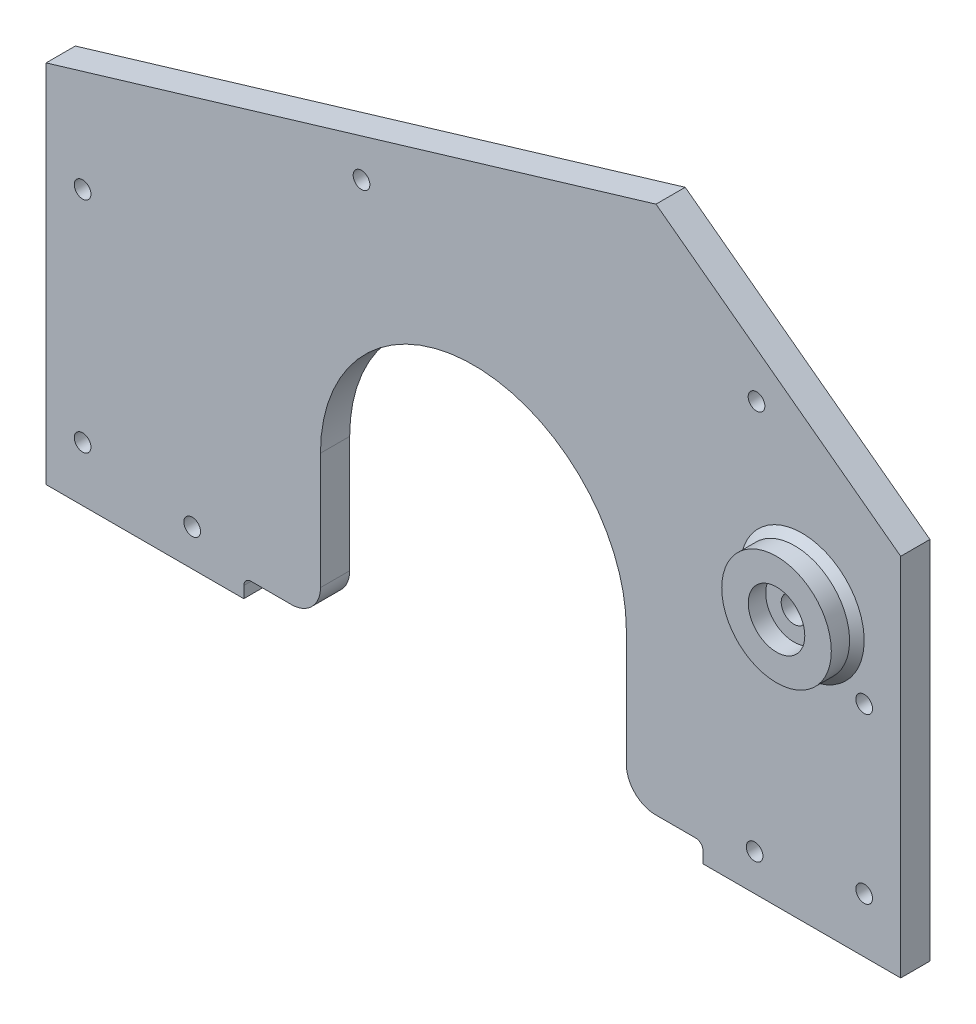
ISO-10303-21;
HEADER;
FILE_DESCRIPTION(('STEP AP214'),'2;1');
FILE_NAME('part.step','',(''),(''),'','','');
FILE_SCHEMA(('AUTOMOTIVE_DESIGN { 1 0 10303 214 1 1 1 1 }'));
ENDSEC;
DATA;
#1=APPLICATION_CONTEXT('core data for automotive mechanical design processes');
#2=APPLICATION_PROTOCOL_DEFINITION('international standard','automotive_design',2000,#1);
#3=PRODUCT_CONTEXT('',#1,'mechanical');
#4=PRODUCT('Part','Part','',(#3));
#5=PRODUCT_RELATED_PRODUCT_CATEGORY('part','',(#4));
#6=PRODUCT_DEFINITION_FORMATION('','',#4);
#7=PRODUCT_DEFINITION_CONTEXT('part definition',#1,'design');
#8=PRODUCT_DEFINITION('design','',#6,#7);
#9=PRODUCT_DEFINITION_SHAPE('','',#8);
#10=(LENGTH_UNIT() NAMED_UNIT(*) SI_UNIT(.MILLI.,.METRE.));
#11=(NAMED_UNIT(*) PLANE_ANGLE_UNIT() SI_UNIT($,.RADIAN.));
#12=(NAMED_UNIT(*) SI_UNIT($,.STERADIAN.) SOLID_ANGLE_UNIT());
#13=UNCERTAINTY_MEASURE_WITH_UNIT(LENGTH_MEASURE(1.E-05),#10,'distance_accuracy_value','');
#14=(GEOMETRIC_REPRESENTATION_CONTEXT(3) GLOBAL_UNCERTAINTY_ASSIGNED_CONTEXT((#13)) GLOBAL_UNIT_ASSIGNED_CONTEXT((#10,
#11,#12)) REPRESENTATION_CONTEXT('',''));
#15=CARTESIAN_POINT('',(0.,0.,0.));
#16=DIRECTION('',(0.,0.,1.));
#17=DIRECTION('',(1.,0.,0.));
#18=AXIS2_PLACEMENT_3D('',#15,#16,#17);
#19=CARTESIAN_POINT('',(71.7933930921227,5.32652504062577,-2.));
#20=DIRECTION('',(0.,0.,1.));
#21=DIRECTION('',(1.,0.,0.));
#22=AXIS2_PLACEMENT_3D('',#19,#20,#21);
#23=CYLINDRICAL_SURFACE('',#22,3.50000000000001);
#24=CARTESIAN_POINT('',(71.7933930921227,5.32652504062577,0.));
#25=DIRECTION('',(0.,0.,-1.));
#26=DIRECTION('',(-1.,0.,0.));
#27=AXIS2_PLACEMENT_3D('',#24,#25,#26);
#28=CIRCLE('',#27,3.50000000000001);
#29=CARTESIAN_POINT('',(68.2933930921227,5.32652504062577,0.));
#30=VERTEX_POINT('',#29);
#31=EDGE_CURVE('E186',#30,#30,#28,.T.);
#32=ORIENTED_EDGE('',*,*,#31,.T.);
#33=EDGE_LOOP('',(#32));
#34=FACE_BOUND('',#33,.T.);
#35=CARTESIAN_POINT('',(71.7933930921227,5.32652504062577,10.222));
#36=DIRECTION('',(0.,0.,1.));
#37=DIRECTION('',(1.,0.,0.));
#38=AXIS2_PLACEMENT_3D('',#35,#36,#37);
#39=CIRCLE('',#38,3.50000000000001);
#40=CARTESIAN_POINT('',(75.2933930921227,5.32652504062577,10.222));
#41=VERTEX_POINT('',#40);
#42=EDGE_CURVE('E235',#41,#41,#39,.F.);
#43=ORIENTED_EDGE('',*,*,#42,.F.);
#44=EDGE_LOOP('',(#43));
#45=FACE_BOUND('',#44,.T.);
#46=ADVANCED_FACE('F41',(#34,#45),#23,.F.);
#47=CARTESIAN_POINT('',(98.7933930921227,-69.6734749593742,8.));
#48=DIRECTION('',(0.,1.,0.));
#49=DIRECTION('',(-1.,0.,0.));
#50=AXIS2_PLACEMENT_3D('',#47,#48,#49);
#51=PLANE('',#50);
#52=DIRECTION('',(1.,0.,0.));
#53=VECTOR('',#52,1.);
#54=CARTESIAN_POINT('',(98.7933930921227,-69.6734749593742,8.));
#55=LINE('',#54,#53);
#56=CARTESIAN_POINT('',(44.6683930921227,-69.6734749593742,8.));
#57=VERTEX_POINT('',#56);
#58=CARTESIAN_POINT('',(98.7933930921227,-69.6734749593742,8.));
#59=VERTEX_POINT('',#58);
#60=EDGE_CURVE('E207',#57,#59,#55,.T.);
#61=ORIENTED_EDGE('',*,*,#60,.F.);
#62=DIRECTION('',(0.,0.,-1.));
#63=VECTOR('',#62,1.);
#64=CARTESIAN_POINT('',(44.6683930921227,-69.6734749593742,8.));
#65=LINE('',#64,#63);
#66=CARTESIAN_POINT('',(44.6683930921227,-69.6734749593742,0.));
#67=VERTEX_POINT('',#66);
#68=EDGE_CURVE('E173',#57,#67,#65,.T.);
#69=ORIENTED_EDGE('',*,*,#68,.T.);
#70=DIRECTION('',(1.,0.,0.));
#71=VECTOR('',#70,1.);
#72=CARTESIAN_POINT('',(98.7933930921227,-69.6734749593742,0.));
#73=LINE('',#72,#71);
#74=CARTESIAN_POINT('',(98.7933930921227,-69.6734749593742,0.));
#75=VERTEX_POINT('',#74);
#76=EDGE_CURVE('E193',#67,#75,#73,.T.);
#77=ORIENTED_EDGE('',*,*,#76,.T.);
#78=DIRECTION('',(0.,0.,-1.));
#79=VECTOR('',#78,1.);
#80=CARTESIAN_POINT('',(98.7933930921227,-69.6734749593742,8.));
#81=LINE('',#80,#79);
#82=EDGE_CURVE('E174',#59,#75,#81,.T.);
#83=ORIENTED_EDGE('',*,*,#82,.F.);
#84=EDGE_LOOP('',(#61,#69,#77,#83));
#85=FACE_BOUND('',#84,.T.);
#86=ADVANCED_FACE('F291',(#85),#51,.F.);
#87=CARTESIAN_POINT('',(0.,0.,8.));
#88=DIRECTION('',(0.,0.,-1.));
#89=DIRECTION('',(-1.,0.,0.));
#90=AXIS2_PLACEMENT_3D('',#87,#88,#89);
#91=PLANE('',#90);
#92=CARTESIAN_POINT('',(71.7933930921227,5.32652504062577,8.));
#93=DIRECTION('',(0.,0.,-1.));
#94=DIRECTION('',(-1.,0.,0.));
#95=AXIS2_PLACEMENT_3D('',#92,#93,#94);
#96=CIRCLE('',#95,17.);
#97=CARTESIAN_POINT('',(54.7933930921227,5.32652504062577,8.));
#98=VERTEX_POINT('',#97);
#99=EDGE_CURVE('E11',#98,#98,#96,.T.);
#100=ORIENTED_EDGE('',*,*,#99,.T.);
#101=EDGE_LOOP('',(#100));
#102=FACE_BOUND('',#101,.T.);
#103=DIRECTION('',(0.,1.,0.));
#104=VECTOR('',#103,1.);
#105=CARTESIAN_POINT('',(-81.0816069078773,0.,8.));
#106=LINE('',#105,#104);
#107=CARTESIAN_POINT('',(-81.0816069078773,-69.6734749593742,8.));
#108=VERTEX_POINT('',#107);
#109=CARTESIAN_POINT('',(-81.0816069078773,-66.5434749593742,8.));
#110=VERTEX_POINT('',#109);
#111=EDGE_CURVE('E168',#108,#110,#106,.T.);
#112=ORIENTED_EDGE('',*,*,#111,.T.);
#113=CARTESIAN_POINT('',(-79.0816069078773,-66.5434749593742,8.));
#114=DIRECTION('',(0.,0.,-1.));
#115=DIRECTION('',(-1.,0.,0.));
#116=AXIS2_PLACEMENT_3D('',#113,#114,#115);
#117=CIRCLE('',#116,2.);
#118=CARTESIAN_POINT('',(-79.0816069078773,-64.5434749593742,8.));
#119=VERTEX_POINT('',#118);
#120=EDGE_CURVE('E269',#110,#119,#117,.T.);
#121=ORIENTED_EDGE('',*,*,#120,.T.);
#122=DIRECTION('',(1.,0.,0.));
#123=VECTOR('',#122,1.);
#124=CARTESIAN_POINT('',(0.,-64.5434749593742,8.));
#125=LINE('',#124,#123);
#126=CARTESIAN_POINT('',(-68.0816069078773,-64.5434749593742,8.));
#127=VERTEX_POINT('',#126);
#128=EDGE_CURVE('E393',#119,#127,#125,.T.);
#129=ORIENTED_EDGE('',*,*,#128,.T.);
#130=CARTESIAN_POINT('',(-68.0816069078773,-56.5434749593742,8.));
#131=DIRECTION('',(0.,0.,-1.));
#132=DIRECTION('',(-1.,0.,0.));
#133=AXIS2_PLACEMENT_3D('',#130,#131,#132);
#134=CIRCLE('',#133,8.);
#135=CARTESIAN_POINT('',(-60.0816069078773,-56.5434749593742,8.));
#136=VERTEX_POINT('',#135);
#137=EDGE_CURVE('E247',#127,#136,#134,.F.);
#138=ORIENTED_EDGE('',*,*,#137,.T.);
#139=DIRECTION('',(0.,1.,0.));
#140=VECTOR('',#139,1.);
#141=CARTESIAN_POINT('',(-60.0816069078773,0.,8.));
#142=LINE('',#141,#140);
#143=CARTESIAN_POINT('',(-60.0816069078773,-24.6734749593742,8.));
#144=VERTEX_POINT('',#143);
#145=EDGE_CURVE('E391',#136,#144,#142,.T.);
#146=ORIENTED_EDGE('',*,*,#145,.T.);
#147=CARTESIAN_POINT('',(-18.2066069078773,-24.6734749593742,8.));
#148=DIRECTION('',(0.,0.,-1.));
#149=DIRECTION('',(-1.,0.,0.));
#150=AXIS2_PLACEMENT_3D('',#147,#148,#149);
#151=CIRCLE('',#150,41.875);
#152=CARTESIAN_POINT('',(23.6683930921227,-24.6734749593742,8.));
#153=VERTEX_POINT('',#152);
#154=EDGE_CURVE('E400',#144,#153,#151,.T.);
#155=ORIENTED_EDGE('',*,*,#154,.T.);
#156=DIRECTION('',(0.,-1.,0.));
#157=VECTOR('',#156,1.);
#158=CARTESIAN_POINT('',(23.6683930921227,0.,8.));
#159=LINE('',#158,#157);
#160=CARTESIAN_POINT('',(23.6683930921227,-56.5434749593742,8.));
#161=VERTEX_POINT('',#160);
#162=EDGE_CURVE('E397',#153,#161,#159,.T.);
#163=ORIENTED_EDGE('',*,*,#162,.T.);
#164=CARTESIAN_POINT('',(31.6683930921227,-56.5434749593742,8.));
#165=DIRECTION('',(0.,0.,-1.));
#166=DIRECTION('',(-1.,0.,0.));
#167=AXIS2_PLACEMENT_3D('',#164,#165,#166);
#168=CIRCLE('',#167,8.);
#169=CARTESIAN_POINT('',(31.6683930921227,-64.5434749593742,8.));
#170=VERTEX_POINT('',#169);
#171=EDGE_CURVE('E245',#161,#170,#168,.F.);
#172=ORIENTED_EDGE('',*,*,#171,.T.);
#173=DIRECTION('',(1.,0.,0.));
#174=VECTOR('',#173,1.);
#175=CARTESIAN_POINT('',(0.,-64.5434749593742,8.));
#176=LINE('',#175,#174);
#177=CARTESIAN_POINT('',(42.6683930921227,-64.5434749593742,8.));
#178=VERTEX_POINT('',#177);
#179=EDGE_CURVE('E395',#170,#178,#176,.T.);
#180=ORIENTED_EDGE('',*,*,#179,.T.);
#181=CARTESIAN_POINT('',(42.6683930921227,-66.5434749593742,8.));
#182=DIRECTION('',(0.,0.,-1.));
#183=DIRECTION('',(-1.,0.,0.));
#184=AXIS2_PLACEMENT_3D('',#181,#182,#183);
#185=CIRCLE('',#184,2.);
#186=CARTESIAN_POINT('',(44.6683930921227,-66.5434749593742,8.));
#187=VERTEX_POINT('',#186);
#188=EDGE_CURVE('E57',#178,#187,#185,.T.);
#189=ORIENTED_EDGE('',*,*,#188,.T.);
#190=DIRECTION('',(0.,-1.,0.));
#191=VECTOR('',#190,1.);
#192=CARTESIAN_POINT('',(44.6683930921227,0.,8.));
#193=LINE('',#192,#191);
#194=EDGE_CURVE('E386',#187,#57,#193,.T.);
#195=ORIENTED_EDGE('',*,*,#194,.T.);
#196=ORIENTED_EDGE('',*,*,#60,.T.);
#197=DIRECTION('',(0.,1.,0.));
#198=VECTOR('',#197,1.);
#199=CARTESIAN_POINT('',(98.7933930921227,30.3265250406258,8.));
#200=LINE('',#199,#198);
#201=CARTESIAN_POINT('',(98.7933930921227,30.3265250406258,8.));
#202=VERTEX_POINT('',#201);
#203=EDGE_CURVE('E454',#59,#202,#200,.T.);
#204=ORIENTED_EDGE('',*,*,#203,.T.);
#205=DIRECTION('',(-0.801433113275891,0.598084412892456,0.));
#206=VECTOR('',#205,1.);
#207=CARTESIAN_POINT('',(31.7933930921227,80.3265250406258,8.));
#208=LINE('',#207,#206);
#209=CARTESIAN_POINT('',(31.7933930921227,80.3265250406258,8.));
#210=VERTEX_POINT('',#209);
#211=EDGE_CURVE('E456',#202,#210,#208,.T.);
#212=ORIENTED_EDGE('',*,*,#211,.T.);
#213=DIRECTION('',(-0.957984024069043,-0.286821564092528,0.));
#214=VECTOR('',#213,1.);
#215=CARTESIAN_POINT('',(-135.206606907877,30.3265250406258,8.));
#216=LINE('',#215,#214);
#217=CARTESIAN_POINT('',(-135.206606907877,30.3265250406258,8.));
#218=VERTEX_POINT('',#217);
#219=EDGE_CURVE('E457',#210,#218,#216,.T.);
#220=ORIENTED_EDGE('',*,*,#219,.T.);
#221=DIRECTION('',(0.,-1.,0.));
#222=VECTOR('',#221,1.);
#223=CARTESIAN_POINT('',(-135.206606907877,-69.6734749593742,8.));
#224=LINE('',#223,#222);
#225=CARTESIAN_POINT('',(-135.206606907877,-69.6734749593742,8.));
#226=VERTEX_POINT('',#225);
#227=EDGE_CURVE('E199',#218,#226,#224,.T.);
#228=ORIENTED_EDGE('',*,*,#227,.T.);
#229=EDGE_CURVE('E383',#226,#108,#55,.T.);
#230=ORIENTED_EDGE('',*,*,#229,.T.);
#231=EDGE_LOOP('',(#112,#121,#129,#138,#146,#155,#163,#172,#180,#189,#195,#196,#204,#212,#220,
#228,#230));
#232=FACE_BOUND('',#231,.T.);
#233=CARTESIAN_POINT('',(-125.206606907877,5.32652504062577,8.));
#234=DIRECTION('',(0.,0.,1.));
#235=DIRECTION('',(1.,0.,0.));
#236=AXIS2_PLACEMENT_3D('',#233,#234,#235);
#237=CIRCLE('',#236,2.28499999999999);
#238=CARTESIAN_POINT('',(-122.921606907877,5.32652504062577,8.));
#239=VERTEX_POINT('',#238);
#240=EDGE_CURVE('E197',#239,#239,#237,.T.);
#241=ORIENTED_EDGE('',*,*,#240,.F.);
#242=EDGE_LOOP('',(#241));
#243=FACE_BOUND('',#242,.T.);
#244=CARTESIAN_POINT('',(-125.206606907877,-54.6734749593742,8.));
#245=DIRECTION('',(0.,0.,1.));
#246=DIRECTION('',(-1.,0.,0.));
#247=AXIS2_PLACEMENT_3D('',#244,#245,#246);
#248=CIRCLE('',#247,2.28499999999999);
#249=CARTESIAN_POINT('',(-127.491606907877,-54.6734749593742,8.));
#250=VERTEX_POINT('',#249);
#251=EDGE_CURVE('E443',#250,#250,#248,.T.);
#252=ORIENTED_EDGE('',*,*,#251,.F.);
#253=EDGE_LOOP('',(#252));
#254=FACE_BOUND('',#253,.T.);
#255=CARTESIAN_POINT('',(-95.2066069078773,-59.6734749593742,8.));
#256=DIRECTION('',(0.,0.,1.));
#257=DIRECTION('',(1.,0.,0.));
#258=AXIS2_PLACEMENT_3D('',#255,#256,#257);
#259=CIRCLE('',#258,2.285);
#260=CARTESIAN_POINT('',(-92.9216069078773,-59.6734749593742,8.));
#261=VERTEX_POINT('',#260);
#262=EDGE_CURVE('E437',#261,#261,#259,.T.);
#263=ORIENTED_EDGE('',*,*,#262,.F.);
#264=EDGE_LOOP('',(#263));
#265=FACE_BOUND('',#264,.T.);
#266=CARTESIAN_POINT('',(58.7933930921227,-59.6734749593742,8.));
#267=DIRECTION('',(0.,0.,1.));
#268=DIRECTION('',(-1.,0.,0.));
#269=AXIS2_PLACEMENT_3D('',#266,#267,#268);
#270=CIRCLE('',#269,2.285);
#271=CARTESIAN_POINT('',(56.5083930921227,-59.6734749593742,8.));
#272=VERTEX_POINT('',#271);
#273=EDGE_CURVE('E431',#272,#272,#270,.T.);
#274=ORIENTED_EDGE('',*,*,#273,.F.);
#275=EDGE_LOOP('',(#274));
#276=FACE_BOUND('',#275,.T.);
#277=CARTESIAN_POINT('',(88.7933930921227,-54.6734749593742,8.));
#278=DIRECTION('',(0.,0.,1.));
#279=DIRECTION('',(1.,0.,0.));
#280=AXIS2_PLACEMENT_3D('',#277,#278,#279);
#281=CIRCLE('',#280,2.28499999999996);
#282=CARTESIAN_POINT('',(91.0783930921226,-54.6734749593742,8.));
#283=VERTEX_POINT('',#282);
#284=EDGE_CURVE('E425',#283,#283,#281,.T.);
#285=ORIENTED_EDGE('',*,*,#284,.F.);
#286=EDGE_LOOP('',(#285));
#287=FACE_BOUND('',#286,.T.);
#288=CARTESIAN_POINT('',(59.3125489631981,47.3121939078669,8.));
#289=DIRECTION('',(0.,0.,1.));
#290=DIRECTION('',(1.,0.,0.));
#291=AXIS2_PLACEMENT_3D('',#288,#289,#290);
#292=CIRCLE('',#291,2.28499999999999);
#293=CARTESIAN_POINT('',(61.5975489631981,47.3121939078669,8.));
#294=VERTEX_POINT('',#293);
#295=EDGE_CURVE('E419',#294,#294,#292,.T.);
#296=ORIENTED_EDGE('',*,*,#295,.F.);
#297=EDGE_LOOP('',(#296));
#298=FACE_BOUND('',#297,.T.);
#299=CARTESIAN_POINT('',(-48.8383912669521,45.7466847999354,8.));
#300=DIRECTION('',(0.,0.,1.));
#301=DIRECTION('',(1.,0.,0.));
#302=AXIS2_PLACEMENT_3D('',#299,#300,#301);
#303=CIRCLE('',#302,2.285);
#304=CARTESIAN_POINT('',(-46.5533912669521,45.7466847999354,8.));
#305=VERTEX_POINT('',#304);
#306=EDGE_CURVE('E413',#305,#305,#303,.T.);
#307=ORIENTED_EDGE('',*,*,#306,.F.);
#308=EDGE_LOOP('',(#307));
#309=FACE_BOUND('',#308,.T.);
#310=CARTESIAN_POINT('',(88.7933930921227,-9.67347495937424,8.));
#311=DIRECTION('',(0.,0.,1.));
#312=DIRECTION('',(1.,0.,0.));
#313=AXIS2_PLACEMENT_3D('',#310,#311,#312);
#314=CIRCLE('',#313,2.28499999999999);
#315=CARTESIAN_POINT('',(91.0783930921227,-9.67347495937424,8.));
#316=VERTEX_POINT('',#315);
#317=EDGE_CURVE('E407',#316,#316,#314,.T.);
#318=ORIENTED_EDGE('',*,*,#317,.F.);
#319=EDGE_LOOP('',(#318));
#320=FACE_BOUND('',#319,.T.);
#321=ADVANCED_FACE('F299',(#102,#232,#243,#254,#265,#276,#287,#298,#309,#320),#91,.F.);
#322=CARTESIAN_POINT('',(0.,0.,0.));
#323=DIRECTION('',(0.,0.,-1.));
#324=DIRECTION('',(-1.,0.,0.));
#325=AXIS2_PLACEMENT_3D('',#322,#323,#324);
#326=PLANE('',#325);
#327=DIRECTION('',(0.,1.,0.));
#328=VECTOR('',#327,1.);
#329=CARTESIAN_POINT('',(-60.0816069078773,0.,0.));
#330=LINE('',#329,#328);
#331=CARTESIAN_POINT('',(-60.0816069078773,-56.5434749593742,0.));
#332=VERTEX_POINT('',#331);
#333=CARTESIAN_POINT('',(-60.0816069078773,-24.6734749593742,0.));
#334=VERTEX_POINT('',#333);
#335=EDGE_CURVE('E222',#332,#334,#330,.T.);
#336=ORIENTED_EDGE('',*,*,#335,.F.);
#337=CARTESIAN_POINT('',(-68.0816069078773,-56.5434749593742,0.));
#338=DIRECTION('',(0.,0.,-1.));
#339=DIRECTION('',(-1.,0.,0.));
#340=AXIS2_PLACEMENT_3D('',#337,#338,#339);
#341=CIRCLE('',#340,8.);
#342=CARTESIAN_POINT('',(-68.0816069078773,-64.5434749593742,0.));
#343=VERTEX_POINT('',#342);
#344=EDGE_CURVE('E253',#332,#343,#341,.T.);
#345=ORIENTED_EDGE('',*,*,#344,.T.);
#346=DIRECTION('',(1.,0.,0.));
#347=VECTOR('',#346,1.);
#348=CARTESIAN_POINT('',(0.,-64.5434749593742,0.));
#349=LINE('',#348,#347);
#350=CARTESIAN_POINT('',(-79.0816069078773,-64.5434749593742,0.));
#351=VERTEX_POINT('',#350);
#352=EDGE_CURVE('E224',#351,#343,#349,.T.);
#353=ORIENTED_EDGE('',*,*,#352,.F.);
#354=CARTESIAN_POINT('',(-79.0816069078773,-66.5434749593742,0.));
#355=DIRECTION('',(0.,0.,-1.));
#356=DIRECTION('',(-1.,0.,0.));
#357=AXIS2_PLACEMENT_3D('',#354,#355,#356);
#358=CIRCLE('',#357,2.);
#359=CARTESIAN_POINT('',(-81.0816069078773,-66.5434749593742,0.));
#360=VERTEX_POINT('',#359);
#361=EDGE_CURVE('E185',#351,#360,#358,.F.);
#362=ORIENTED_EDGE('',*,*,#361,.T.);
#363=DIRECTION('',(0.,1.,0.));
#364=VECTOR('',#363,1.);
#365=CARTESIAN_POINT('',(-81.0816069078773,0.,0.));
#366=LINE('',#365,#364);
#367=CARTESIAN_POINT('',(-81.0816069078773,-69.6734749593742,0.));
#368=VERTEX_POINT('',#367);
#369=EDGE_CURVE('E165',#368,#360,#366,.T.);
#370=ORIENTED_EDGE('',*,*,#369,.F.);
#371=CARTESIAN_POINT('',(-135.206606907877,-69.6734749593742,0.));
#372=VERTEX_POINT('',#371);
#373=EDGE_CURVE('E182',#372,#368,#73,.T.);
#374=ORIENTED_EDGE('',*,*,#373,.F.);
#375=DIRECTION('',(0.,-1.,0.));
#376=VECTOR('',#375,1.);
#377=CARTESIAN_POINT('',(-135.206606907877,-69.6734749593742,0.));
#378=LINE('',#377,#376);
#379=CARTESIAN_POINT('',(-135.206606907877,30.3265250406258,0.));
#380=VERTEX_POINT('',#379);
#381=EDGE_CURVE('E205',#380,#372,#378,.T.);
#382=ORIENTED_EDGE('',*,*,#381,.F.);
#383=DIRECTION('',(-0.957984024069043,-0.286821564092528,0.));
#384=VECTOR('',#383,1.);
#385=CARTESIAN_POINT('',(-135.206606907877,30.3265250406258,0.));
#386=LINE('',#385,#384);
#387=CARTESIAN_POINT('',(31.7933930921227,80.3265250406258,0.));
#388=VERTEX_POINT('',#387);
#389=EDGE_CURVE('E203',#388,#380,#386,.T.);
#390=ORIENTED_EDGE('',*,*,#389,.F.);
#391=DIRECTION('',(-0.801433113275891,0.598084412892456,0.));
#392=VECTOR('',#391,1.);
#393=CARTESIAN_POINT('',(31.7933930921227,80.3265250406258,0.));
#394=LINE('',#393,#392);
#395=CARTESIAN_POINT('',(98.7933930921227,30.3265250406258,0.));
#396=VERTEX_POINT('',#395);
#397=EDGE_CURVE('E195',#396,#388,#394,.T.);
#398=ORIENTED_EDGE('',*,*,#397,.F.);
#399=DIRECTION('',(0.,1.,0.));
#400=VECTOR('',#399,1.);
#401=CARTESIAN_POINT('',(98.7933930921227,30.3265250406258,0.));
#402=LINE('',#401,#400);
#403=EDGE_CURVE('E192',#75,#396,#402,.T.);
#404=ORIENTED_EDGE('',*,*,#403,.F.);
#405=ORIENTED_EDGE('',*,*,#76,.F.);
#406=DIRECTION('',(0.,-1.,0.));
#407=VECTOR('',#406,1.);
#408=CARTESIAN_POINT('',(44.6683930921227,0.,0.));
#409=LINE('',#408,#407);
#410=CARTESIAN_POINT('',(44.6683930921227,-66.5434749593742,0.));
#411=VERTEX_POINT('',#410);
#412=EDGE_CURVE('E384',#411,#67,#409,.T.);
#413=ORIENTED_EDGE('',*,*,#412,.F.);
#414=CARTESIAN_POINT('',(42.6683930921227,-66.5434749593742,0.));
#415=DIRECTION('',(0.,0.,-1.));
#416=DIRECTION('',(-1.,0.,0.));
#417=AXIS2_PLACEMENT_3D('',#414,#415,#416);
#418=CIRCLE('',#417,2.);
#419=CARTESIAN_POINT('',(42.6683930921227,-64.5434749593742,0.));
#420=VERTEX_POINT('',#419);
#421=EDGE_CURVE('E273',#411,#420,#418,.F.);
#422=ORIENTED_EDGE('',*,*,#421,.T.);
#423=DIRECTION('',(1.,0.,0.));
#424=VECTOR('',#423,1.);
#425=CARTESIAN_POINT('',(0.,-64.5434749593742,0.));
#426=LINE('',#425,#424);
#427=CARTESIAN_POINT('',(31.6683930921227,-64.5434749593742,0.));
#428=VERTEX_POINT('',#427);
#429=EDGE_CURVE('E231',#428,#420,#426,.T.);
#430=ORIENTED_EDGE('',*,*,#429,.F.);
#431=CARTESIAN_POINT('',(31.6683930921227,-56.5434749593742,0.));
#432=DIRECTION('',(0.,0.,-1.));
#433=DIRECTION('',(-1.,0.,0.));
#434=AXIS2_PLACEMENT_3D('',#431,#432,#433);
#435=CIRCLE('',#434,8.);
#436=CARTESIAN_POINT('',(23.6683930921227,-56.5434749593742,0.));
#437=VERTEX_POINT('',#436);
#438=EDGE_CURVE('E251',#428,#437,#435,.T.);
#439=ORIENTED_EDGE('',*,*,#438,.T.);
#440=DIRECTION('',(0.,-1.,0.));
#441=VECTOR('',#440,1.);
#442=CARTESIAN_POINT('',(23.6683930921227,0.,0.));
#443=LINE('',#442,#441);
#444=CARTESIAN_POINT('',(23.6683930921227,-24.6734749593742,0.));
#445=VERTEX_POINT('',#444);
#446=EDGE_CURVE('E228',#445,#437,#443,.T.);
#447=ORIENTED_EDGE('',*,*,#446,.F.);
#448=CARTESIAN_POINT('',(-18.2066069078773,-24.6734749593742,0.));
#449=DIRECTION('',(0.,0.,-1.));
#450=DIRECTION('',(-1.,0.,0.));
#451=AXIS2_PLACEMENT_3D('',#448,#449,#450);
#452=CIRCLE('',#451,41.875);
#453=EDGE_CURVE('E226',#334,#445,#452,.T.);
#454=ORIENTED_EDGE('',*,*,#453,.F.);
#455=EDGE_LOOP('',(#336,#345,#353,#362,#370,#374,#382,#390,#398,#404,#405,#413,#422,#430,#439,
#447,#454));
#456=FACE_BOUND('',#455,.T.);
#457=ORIENTED_EDGE('',*,*,#31,.F.);
#458=EDGE_LOOP('',(#457));
#459=FACE_BOUND('',#458,.T.);
#460=CARTESIAN_POINT('',(-48.8383912669521,45.7466847999354,0.));
#461=DIRECTION('',(0.,0.,1.));
#462=DIRECTION('',(1.,0.,0.));
#463=AXIS2_PLACEMENT_3D('',#460,#461,#462);
#464=CIRCLE('',#463,2.285);
#465=CARTESIAN_POINT('',(-46.5533912669521,45.7466847999354,0.));
#466=VERTEX_POINT('',#465);
#467=EDGE_CURVE('E410',#466,#466,#464,.T.);
#468=ORIENTED_EDGE('',*,*,#467,.T.);
#469=EDGE_LOOP('',(#468));
#470=FACE_BOUND('',#469,.T.);
#471=CARTESIAN_POINT('',(88.7933930921227,-54.6734749593742,0.));
#472=DIRECTION('',(0.,0.,1.));
#473=DIRECTION('',(1.,0.,0.));
#474=AXIS2_PLACEMENT_3D('',#471,#472,#473);
#475=CIRCLE('',#474,2.28499999999996);
#476=CARTESIAN_POINT('',(91.0783930921226,-54.6734749593742,0.));
#477=VERTEX_POINT('',#476);
#478=EDGE_CURVE('E422',#477,#477,#475,.T.);
#479=ORIENTED_EDGE('',*,*,#478,.T.);
#480=EDGE_LOOP('',(#479));
#481=FACE_BOUND('',#480,.T.);
#482=CARTESIAN_POINT('',(-95.2066069078773,-59.6734749593742,0.));
#483=DIRECTION('',(0.,0.,1.));
#484=DIRECTION('',(1.,0.,0.));
#485=AXIS2_PLACEMENT_3D('',#482,#483,#484);
#486=CIRCLE('',#485,2.285);
#487=CARTESIAN_POINT('',(-92.9216069078773,-59.6734749593742,0.));
#488=VERTEX_POINT('',#487);
#489=EDGE_CURVE('E434',#488,#488,#486,.T.);
#490=ORIENTED_EDGE('',*,*,#489,.T.);
#491=EDGE_LOOP('',(#490));
#492=FACE_BOUND('',#491,.T.);
#493=CARTESIAN_POINT('',(-125.206606907877,5.32652504062577,0.));
#494=DIRECTION('',(0.,0.,1.));
#495=DIRECTION('',(1.,0.,0.));
#496=AXIS2_PLACEMENT_3D('',#493,#494,#495);
#497=CIRCLE('',#496,2.28499999999999);
#498=CARTESIAN_POINT('',(-122.921606907877,5.32652504062577,0.));
#499=VERTEX_POINT('',#498);
#500=EDGE_CURVE('E446',#499,#499,#497,.T.);
#501=ORIENTED_EDGE('',*,*,#500,.T.);
#502=EDGE_LOOP('',(#501));
#503=FACE_BOUND('',#502,.T.);
#504=CARTESIAN_POINT('',(-125.206606907877,-54.6734749593742,0.));
#505=DIRECTION('',(0.,0.,1.));
#506=DIRECTION('',(-1.,0.,0.));
#507=AXIS2_PLACEMENT_3D('',#504,#505,#506);
#508=CIRCLE('',#507,2.28499999999999);
#509=CARTESIAN_POINT('',(-127.491606907877,-54.6734749593742,0.));
#510=VERTEX_POINT('',#509);
#511=EDGE_CURVE('E440',#510,#510,#508,.T.);
#512=ORIENTED_EDGE('',*,*,#511,.T.);
#513=EDGE_LOOP('',(#512));
#514=FACE_BOUND('',#513,.T.);
#515=CARTESIAN_POINT('',(58.7933930921227,-59.6734749593742,0.));
#516=DIRECTION('',(0.,0.,1.));
#517=DIRECTION('',(-1.,0.,0.));
#518=AXIS2_PLACEMENT_3D('',#515,#516,#517);
#519=CIRCLE('',#518,2.285);
#520=CARTESIAN_POINT('',(56.5083930921227,-59.6734749593742,0.));
#521=VERTEX_POINT('',#520);
#522=EDGE_CURVE('E428',#521,#521,#519,.T.);
#523=ORIENTED_EDGE('',*,*,#522,.T.);
#524=EDGE_LOOP('',(#523));
#525=FACE_BOUND('',#524,.T.);
#526=CARTESIAN_POINT('',(59.3125489631981,47.3121939078669,0.));
#527=DIRECTION('',(0.,0.,1.));
#528=DIRECTION('',(1.,0.,0.));
#529=AXIS2_PLACEMENT_3D('',#526,#527,#528);
#530=CIRCLE('',#529,2.28499999999999);
#531=CARTESIAN_POINT('',(61.5975489631981,47.3121939078669,0.));
#532=VERTEX_POINT('',#531);
#533=EDGE_CURVE('E416',#532,#532,#530,.T.);
#534=ORIENTED_EDGE('',*,*,#533,.T.);
#535=EDGE_LOOP('',(#534));
#536=FACE_BOUND('',#535,.T.);
#537=CARTESIAN_POINT('',(88.7933930921227,-9.67347495937424,0.));
#538=DIRECTION('',(0.,0.,1.));
#539=DIRECTION('',(1.,0.,0.));
#540=AXIS2_PLACEMENT_3D('',#537,#538,#539);
#541=CIRCLE('',#540,2.28499999999999);
#542=CARTESIAN_POINT('',(91.0783930921227,-9.67347495937424,0.));
#543=VERTEX_POINT('',#542);
#544=EDGE_CURVE('E406',#543,#543,#541,.T.);
#545=ORIENTED_EDGE('',*,*,#544,.T.);
#546=EDGE_LOOP('',(#545));
#547=FACE_BOUND('',#546,.T.);
#548=ADVANCED_FACE('F179',(#456,#459,#470,#481,#492,#503,#514,#525,#536,#547),#326,.T.);
#549=ORIENTED_EDGE('',*,*,#373,.T.);
#550=DIRECTION('',(0.,0.,1.));
#551=VECTOR('',#550,1.);
#552=CARTESIAN_POINT('',(-81.0816069078773,-69.6734749593742,8.));
#553=LINE('',#552,#551);
#554=EDGE_CURVE('E161',#368,#108,#553,.T.);
#555=ORIENTED_EDGE('',*,*,#554,.T.);
#556=ORIENTED_EDGE('',*,*,#229,.F.);
#557=DIRECTION('',(0.,0.,-1.));
#558=VECTOR('',#557,1.);
#559=CARTESIAN_POINT('',(-135.206606907877,-69.6734749593742,8.));
#560=LINE('',#559,#558);
#561=EDGE_CURVE('E191',#226,#372,#560,.T.);
#562=ORIENTED_EDGE('',*,*,#561,.T.);
#563=EDGE_LOOP('',(#549,#555,#556,#562));
#564=FACE_BOUND('',#563,.T.);
#565=ADVANCED_FACE('F189',(#564),#51,.F.);
#566=CARTESIAN_POINT('',(98.7933930921227,30.3265250406258,8.));
#567=DIRECTION('',(-1.,0.,0.));
#568=DIRECTION('',(0.,-1.,0.));
#569=AXIS2_PLACEMENT_3D('',#566,#567,#568);
#570=PLANE('',#569);
#571=ORIENTED_EDGE('',*,*,#403,.T.);
#572=DIRECTION('',(0.,0.,-1.));
#573=VECTOR('',#572,1.);
#574=CARTESIAN_POINT('',(98.7933930921227,30.3265250406258,8.));
#575=LINE('',#574,#573);
#576=EDGE_CURVE('E215',#202,#396,#575,.T.);
#577=ORIENTED_EDGE('',*,*,#576,.F.);
#578=ORIENTED_EDGE('',*,*,#203,.F.);
#579=ORIENTED_EDGE('',*,*,#82,.T.);
#580=EDGE_LOOP('',(#571,#577,#578,#579));
#581=FACE_BOUND('',#580,.T.);
#582=ADVANCED_FACE('F360',(#581),#570,.F.);
#583=CARTESIAN_POINT('',(31.7933930921227,80.3265250406258,8.));
#584=DIRECTION('',(-0.598084412892456,-0.801433113275891,0.));
#585=DIRECTION('',(0.801433113275891,-0.598084412892456,0.));
#586=AXIS2_PLACEMENT_3D('',#583,#584,#585);
#587=PLANE('',#586);
#588=ORIENTED_EDGE('',*,*,#397,.T.);
#589=DIRECTION('',(0.,0.,-1.));
#590=VECTOR('',#589,1.);
#591=CARTESIAN_POINT('',(31.7933930921227,80.3265250406258,8.));
#592=LINE('',#591,#590);
#593=EDGE_CURVE('E212',#210,#388,#592,.T.);
#594=ORIENTED_EDGE('',*,*,#593,.F.);
#595=ORIENTED_EDGE('',*,*,#211,.F.);
#596=ORIENTED_EDGE('',*,*,#576,.T.);
#597=EDGE_LOOP('',(#588,#594,#595,#596));
#598=FACE_BOUND('',#597,.T.);
#599=ADVANCED_FACE('F356',(#598),#587,.F.);
#600=CARTESIAN_POINT('',(-135.206606907877,30.3265250406258,8.));
#601=DIRECTION('',(0.286821564092528,-0.957984024069043,0.));
#602=DIRECTION('',(0.957984024069043,0.286821564092528,0.));
#603=AXIS2_PLACEMENT_3D('',#600,#601,#602);
#604=PLANE('',#603);
#605=ORIENTED_EDGE('',*,*,#389,.T.);
#606=DIRECTION('',(0.,0.,-1.));
#607=VECTOR('',#606,1.);
#608=CARTESIAN_POINT('',(-135.206606907877,30.3265250406258,8.));
#609=LINE('',#608,#607);
#610=EDGE_CURVE('E209',#218,#380,#609,.T.);
#611=ORIENTED_EDGE('',*,*,#610,.F.);
#612=ORIENTED_EDGE('',*,*,#219,.F.);
#613=ORIENTED_EDGE('',*,*,#593,.T.);
#614=EDGE_LOOP('',(#605,#611,#612,#613));
#615=FACE_BOUND('',#614,.T.);
#616=ADVANCED_FACE('F352',(#615),#604,.F.);
#617=CARTESIAN_POINT('',(-135.206606907877,-69.6734749593742,8.));
#618=DIRECTION('',(1.,0.,0.));
#619=DIRECTION('',(0.,1.,0.));
#620=AXIS2_PLACEMENT_3D('',#617,#618,#619);
#621=PLANE('',#620);
#622=ORIENTED_EDGE('',*,*,#381,.T.);
#623=ORIENTED_EDGE('',*,*,#561,.F.);
#624=ORIENTED_EDGE('',*,*,#227,.F.);
#625=ORIENTED_EDGE('',*,*,#610,.T.);
#626=EDGE_LOOP('',(#622,#623,#624,#625));
#627=FACE_BOUND('',#626,.T.);
#628=ADVANCED_FACE('F343',(#627),#621,.F.);
#629=CARTESIAN_POINT('',(-125.206606907877,5.32652504062577,8.));
#630=DIRECTION('',(0.,0.,-1.));
#631=DIRECTION('',(-1.,0.,0.));
#632=AXIS2_PLACEMENT_3D('',#629,#630,#631);
#633=CYLINDRICAL_SURFACE('',#632,2.28499999999999);
#634=ORIENTED_EDGE('',*,*,#240,.T.);
#635=EDGE_LOOP('',(#634));
#636=FACE_BOUND('',#635,.T.);
#637=ORIENTED_EDGE('',*,*,#500,.F.);
#638=EDGE_LOOP('',(#637));
#639=FACE_BOUND('',#638,.T.);
#640=ADVANCED_FACE('F339',(#636,#639),#633,.F.);
#641=CARTESIAN_POINT('',(-125.206606907877,-54.6734749593742,8.));
#642=DIRECTION('',(0.,0.,-1.));
#643=DIRECTION('',(-1.,0.,0.));
#644=AXIS2_PLACEMENT_3D('',#641,#642,#643);
#645=CYLINDRICAL_SURFACE('',#644,2.28499999999999);
#646=ORIENTED_EDGE('',*,*,#251,.T.);
#647=EDGE_LOOP('',(#646));
#648=FACE_BOUND('',#647,.T.);
#649=ORIENTED_EDGE('',*,*,#511,.F.);
#650=EDGE_LOOP('',(#649));
#651=FACE_BOUND('',#650,.T.);
#652=ADVANCED_FACE('F335',(#648,#651),#645,.F.);
#653=CARTESIAN_POINT('',(-95.2066069078773,-59.6734749593742,8.));
#654=DIRECTION('',(0.,0.,-1.));
#655=DIRECTION('',(-1.,0.,0.));
#656=AXIS2_PLACEMENT_3D('',#653,#654,#655);
#657=CYLINDRICAL_SURFACE('',#656,2.285);
#658=ORIENTED_EDGE('',*,*,#262,.T.);
#659=EDGE_LOOP('',(#658));
#660=FACE_BOUND('',#659,.T.);
#661=ORIENTED_EDGE('',*,*,#489,.F.);
#662=EDGE_LOOP('',(#661));
#663=FACE_BOUND('',#662,.T.);
#664=ADVANCED_FACE('F331',(#660,#663),#657,.F.);
#665=CARTESIAN_POINT('',(58.7933930921227,-59.6734749593742,8.));
#666=DIRECTION('',(0.,0.,-1.));
#667=DIRECTION('',(-1.,0.,0.));
#668=AXIS2_PLACEMENT_3D('',#665,#666,#667);
#669=CYLINDRICAL_SURFACE('',#668,2.285);
#670=ORIENTED_EDGE('',*,*,#273,.T.);
#671=EDGE_LOOP('',(#670));
#672=FACE_BOUND('',#671,.T.);
#673=ORIENTED_EDGE('',*,*,#522,.F.);
#674=EDGE_LOOP('',(#673));
#675=FACE_BOUND('',#674,.T.);
#676=ADVANCED_FACE('F327',(#672,#675),#669,.F.);
#677=CARTESIAN_POINT('',(88.7933930921227,-54.6734749593742,8.));
#678=DIRECTION('',(0.,0.,-1.));
#679=DIRECTION('',(-1.,0.,0.));
#680=AXIS2_PLACEMENT_3D('',#677,#678,#679);
#681=CYLINDRICAL_SURFACE('',#680,2.28499999999996);
#682=ORIENTED_EDGE('',*,*,#284,.T.);
#683=EDGE_LOOP('',(#682));
#684=FACE_BOUND('',#683,.T.);
#685=ORIENTED_EDGE('',*,*,#478,.F.);
#686=EDGE_LOOP('',(#685));
#687=FACE_BOUND('',#686,.T.);
#688=ADVANCED_FACE('F323',(#684,#687),#681,.F.);
#689=CARTESIAN_POINT('',(59.3125489631981,47.3121939078669,8.));
#690=DIRECTION('',(0.,0.,-1.));
#691=DIRECTION('',(-1.,0.,0.));
#692=AXIS2_PLACEMENT_3D('',#689,#690,#691);
#693=CYLINDRICAL_SURFACE('',#692,2.28499999999999);
#694=ORIENTED_EDGE('',*,*,#295,.T.);
#695=EDGE_LOOP('',(#694));
#696=FACE_BOUND('',#695,.T.);
#697=ORIENTED_EDGE('',*,*,#533,.F.);
#698=EDGE_LOOP('',(#697));
#699=FACE_BOUND('',#698,.T.);
#700=ADVANCED_FACE('F319',(#696,#699),#693,.F.);
#701=CARTESIAN_POINT('',(-48.8383912669521,45.7466847999354,8.));
#702=DIRECTION('',(0.,0.,-1.));
#703=DIRECTION('',(-1.,0.,0.));
#704=AXIS2_PLACEMENT_3D('',#701,#702,#703);
#705=CYLINDRICAL_SURFACE('',#704,2.285);
#706=ORIENTED_EDGE('',*,*,#306,.T.);
#707=EDGE_LOOP('',(#706));
#708=FACE_BOUND('',#707,.T.);
#709=ORIENTED_EDGE('',*,*,#467,.F.);
#710=EDGE_LOOP('',(#709));
#711=FACE_BOUND('',#710,.T.);
#712=ADVANCED_FACE('F315',(#708,#711),#705,.F.);
#713=CARTESIAN_POINT('',(88.7933930921227,-9.67347495937424,8.));
#714=DIRECTION('',(0.,0.,-1.));
#715=DIRECTION('',(-1.,0.,0.));
#716=AXIS2_PLACEMENT_3D('',#713,#714,#715);
#717=CYLINDRICAL_SURFACE('',#716,2.28499999999999);
#718=ORIENTED_EDGE('',*,*,#317,.T.);
#719=EDGE_LOOP('',(#718));
#720=FACE_BOUND('',#719,.T.);
#721=ORIENTED_EDGE('',*,*,#544,.F.);
#722=EDGE_LOOP('',(#721));
#723=FACE_BOUND('',#722,.T.);
#724=ADVANCED_FACE('F312',(#720,#723),#717,.F.);
#725=CARTESIAN_POINT('',(71.7933930921227,5.32652504062577,15.));
#726=DIRECTION('',(0.,0.,-1.));
#727=DIRECTION('',(-1.,0.,0.));
#728=AXIS2_PLACEMENT_3D('',#725,#726,#727);
#729=CYLINDRICAL_SURFACE('',#728,15.);
#730=CARTESIAN_POINT('',(71.7933930921227,5.32652504062577,10.));
#731=DIRECTION('',(0.,0.,-1.));
#732=DIRECTION('',(-1.,0.,0.));
#733=AXIS2_PLACEMENT_3D('',#730,#731,#732);
#734=CIRCLE('',#733,15.);
#735=CARTESIAN_POINT('',(56.7933930921227,5.32652504062577,10.));
#736=VERTEX_POINT('',#735);
#737=EDGE_CURVE('E50',#736,#736,#734,.F.);
#738=ORIENTED_EDGE('',*,*,#737,.T.);
#739=EDGE_LOOP('',(#738));
#740=FACE_BOUND('',#739,.T.);
#741=CARTESIAN_POINT('',(71.7933930921227,5.32652504062577,15.));
#742=DIRECTION('',(0.,0.,1.));
#743=DIRECTION('',(1.,0.,0.));
#744=AXIS2_PLACEMENT_3D('',#741,#742,#743);
#745=CIRCLE('',#744,15.);
#746=CARTESIAN_POINT('',(86.7933930921227,5.32652504062577,15.));
#747=VERTEX_POINT('',#746);
#748=EDGE_CURVE('E403',#747,#747,#745,.T.);
#749=ORIENTED_EDGE('',*,*,#748,.F.);
#750=EDGE_LOOP('',(#749));
#751=FACE_BOUND('',#750,.T.);
#752=ADVANCED_FACE('F277',(#740,#751),#729,.T.);
#753=CARTESIAN_POINT('',(71.7933930921227,5.32652504062577,15.));
#754=DIRECTION('',(0.,0.,1.));
#755=DIRECTION('',(1.,0.,0.));
#756=AXIS2_PLACEMENT_3D('',#753,#754,#755);
#757=PLANE('',#756);
#758=CARTESIAN_POINT('',(71.7933930921227,5.32652504062577,15.));
#759=DIRECTION('',(0.,0.,1.));
#760=DIRECTION('',(1.,0.,0.));
#761=AXIS2_PLACEMENT_3D('',#758,#759,#760);
#762=CIRCLE('',#761,7.73749999999999);
#763=CARTESIAN_POINT('',(79.5308930921227,5.32652504062577,15.));
#764=VERTEX_POINT('',#763);
#765=EDGE_CURVE('E238',#764,#764,#762,.F.);
#766=ORIENTED_EDGE('',*,*,#765,.T.);
#767=EDGE_LOOP('',(#766));
#768=FACE_BOUND('',#767,.T.);
#769=ORIENTED_EDGE('',*,*,#748,.T.);
#770=EDGE_LOOP('',(#769));
#771=FACE_BOUND('',#770,.T.);
#772=ADVANCED_FACE('F308',(#768,#771),#757,.T.);
#773=CARTESIAN_POINT('',(-18.2066069078773,-24.6734749593742,-2.));
#774=DIRECTION('',(0.,0.,1.));
#775=DIRECTION('',(1.,0.,0.));
#776=AXIS2_PLACEMENT_3D('',#773,#774,#775);
#777=CYLINDRICAL_SURFACE('',#776,41.875);
#778=DIRECTION('',(0.,0.,1.));
#779=VECTOR('',#778,1.);
#780=CARTESIAN_POINT('',(-60.0816069078773,-24.6734749593742,-2.));
#781=LINE('',#780,#779);
#782=EDGE_CURVE('E242',#334,#144,#781,.T.);
#783=ORIENTED_EDGE('',*,*,#782,.F.);
#784=ORIENTED_EDGE('',*,*,#453,.T.);
#785=DIRECTION('',(0.,0.,1.));
#786=VECTOR('',#785,1.);
#787=CARTESIAN_POINT('',(23.6683930921227,-24.6734749593742,-2.));
#788=LINE('',#787,#786);
#789=EDGE_CURVE('E488',#445,#153,#788,.T.);
#790=ORIENTED_EDGE('',*,*,#789,.T.);
#791=ORIENTED_EDGE('',*,*,#154,.F.);
#792=EDGE_LOOP('',(#783,#784,#790,#791));
#793=FACE_BOUND('',#792,.T.);
#794=ADVANCED_FACE('F306',(#793),#777,.F.);
#795=CARTESIAN_POINT('',(23.6683930921227,-64.5434749593742,-2.));
#796=DIRECTION('',(1.,0.,0.));
#797=DIRECTION('',(0.,1.,0.));
#798=AXIS2_PLACEMENT_3D('',#795,#796,#797);
#799=PLANE('',#798);
#800=ORIENTED_EDGE('',*,*,#446,.T.);
#801=DIRECTION('',(0.,0.,1.));
#802=VECTOR('',#801,1.);
#803=CARTESIAN_POINT('',(23.6683930921227,-56.5434749593742,-2.));
#804=LINE('',#803,#802);
#805=EDGE_CURVE('E256',#437,#161,#804,.T.);
#806=ORIENTED_EDGE('',*,*,#805,.T.);
#807=ORIENTED_EDGE('',*,*,#162,.F.);
#808=ORIENTED_EDGE('',*,*,#789,.F.);
#809=EDGE_LOOP('',(#800,#806,#807,#808));
#810=FACE_BOUND('',#809,.T.);
#811=ADVANCED_FACE('F486',(#810),#799,.F.);
#812=CARTESIAN_POINT('',(44.6683930921227,-64.5434749593742,-2.));
#813=DIRECTION('',(0.,1.,0.));
#814=DIRECTION('',(-1.,0.,0.));
#815=AXIS2_PLACEMENT_3D('',#812,#813,#814);
#816=PLANE('',#815);
#817=ORIENTED_EDGE('',*,*,#429,.T.);
#818=DIRECTION('',(0.,0.,1.));
#819=VECTOR('',#818,1.);
#820=CARTESIAN_POINT('',(42.6683930921227,-64.5434749593742,8.));
#821=LINE('',#820,#819);
#822=EDGE_CURVE('E265',#420,#178,#821,.T.);
#823=ORIENTED_EDGE('',*,*,#822,.T.);
#824=ORIENTED_EDGE('',*,*,#179,.F.);
#825=DIRECTION('',(0.,0.,1.));
#826=VECTOR('',#825,1.);
#827=CARTESIAN_POINT('',(31.6683930921227,-64.5434749593742,-2.));
#828=LINE('',#827,#826);
#829=EDGE_CURVE('E259',#170,#428,#828,.F.);
#830=ORIENTED_EDGE('',*,*,#829,.T.);
#831=EDGE_LOOP('',(#817,#823,#824,#830));
#832=FACE_BOUND('',#831,.T.);
#833=ADVANCED_FACE('F478',(#832),#816,.F.);
#834=CARTESIAN_POINT('',(-81.0816069078773,-64.5434749593742,-2.));
#835=DIRECTION('',(0.,1.,0.));
#836=DIRECTION('',(-1.,0.,0.));
#837=AXIS2_PLACEMENT_3D('',#834,#835,#836);
#838=PLANE('',#837);
#839=ORIENTED_EDGE('',*,*,#128,.F.);
#840=DIRECTION('',(0.,0.,1.));
#841=VECTOR('',#840,1.);
#842=CARTESIAN_POINT('',(-79.0816069078773,-64.5434749593742,0.));
#843=LINE('',#842,#841);
#844=EDGE_CURVE('E263',#119,#351,#843,.F.);
#845=ORIENTED_EDGE('',*,*,#844,.T.);
#846=ORIENTED_EDGE('',*,*,#352,.T.);
#847=DIRECTION('',(0.,0.,1.));
#848=VECTOR('',#847,1.);
#849=CARTESIAN_POINT('',(-68.0816069078773,-64.5434749593742,-2.));
#850=LINE('',#849,#848);
#851=EDGE_CURVE('E234',#343,#127,#850,.T.);
#852=ORIENTED_EDGE('',*,*,#851,.T.);
#853=EDGE_LOOP('',(#839,#845,#846,#852));
#854=FACE_BOUND('',#853,.T.);
#855=ADVANCED_FACE('F514',(#854),#838,.F.);
#856=CARTESIAN_POINT('',(-60.0816069078773,-64.5434749593742,-2.));
#857=DIRECTION('',(-1.,0.,0.));
#858=DIRECTION('',(0.,-1.,0.));
#859=AXIS2_PLACEMENT_3D('',#856,#857,#858);
#860=PLANE('',#859);
#861=ORIENTED_EDGE('',*,*,#145,.F.);
#862=DIRECTION('',(0.,0.,1.));
#863=VECTOR('',#862,1.);
#864=CARTESIAN_POINT('',(-60.0816069078773,-56.5434749593742,-2.));
#865=LINE('',#864,#863);
#866=EDGE_CURVE('E249',#136,#332,#865,.F.);
#867=ORIENTED_EDGE('',*,*,#866,.T.);
#868=ORIENTED_EDGE('',*,*,#335,.T.);
#869=ORIENTED_EDGE('',*,*,#782,.T.);
#870=EDGE_LOOP('',(#861,#867,#868,#869));
#871=FACE_BOUND('',#870,.T.);
#872=ADVANCED_FACE('F517',(#871),#860,.F.);
#873=CARTESIAN_POINT('',(44.6683930921227,-69.6734749593742,-2.));
#874=DIRECTION('',(1.,0.,0.));
#875=DIRECTION('',(0.,0.,-1.));
#876=AXIS2_PLACEMENT_3D('',#873,#874,#875);
#877=PLANE('',#876);
#878=ORIENTED_EDGE('',*,*,#194,.F.);
#879=DIRECTION('',(0.,0.,1.));
#880=VECTOR('',#879,1.);
#881=CARTESIAN_POINT('',(44.6683930921227,-66.5434749593742,0.));
#882=LINE('',#881,#880);
#883=EDGE_CURVE('E64',#187,#411,#882,.F.);
#884=ORIENTED_EDGE('',*,*,#883,.T.);
#885=ORIENTED_EDGE('',*,*,#412,.T.);
#886=ORIENTED_EDGE('',*,*,#68,.F.);
#887=EDGE_LOOP('',(#878,#884,#885,#886));
#888=FACE_BOUND('',#887,.T.);
#889=ADVANCED_FACE('F473',(#888),#877,.F.);
#890=CARTESIAN_POINT('',(-81.0816069078773,-69.6734749593742,-2.));
#891=DIRECTION('',(-1.,0.,0.));
#892=DIRECTION('',(0.,0.,1.));
#893=AXIS2_PLACEMENT_3D('',#890,#891,#892);
#894=PLANE('',#893);
#895=ORIENTED_EDGE('',*,*,#369,.T.);
#896=DIRECTION('',(0.,0.,1.));
#897=VECTOR('',#896,1.);
#898=CARTESIAN_POINT('',(-81.0816069078773,-66.5434749593742,8.));
#899=LINE('',#898,#897);
#900=EDGE_CURVE('E261',#360,#110,#899,.T.);
#901=ORIENTED_EDGE('',*,*,#900,.T.);
#902=ORIENTED_EDGE('',*,*,#111,.F.);
#903=ORIENTED_EDGE('',*,*,#554,.F.);
#904=EDGE_LOOP('',(#895,#901,#902,#903));
#905=FACE_BOUND('',#904,.T.);
#906=ADVANCED_FACE('F163',(#905),#894,.F.);
#907=CARTESIAN_POINT('',(71.7933930921227,5.32652504062577,10.222));
#908=DIRECTION('',(0.,0.,1.));
#909=DIRECTION('',(1.,0.,0.));
#910=AXIS2_PLACEMENT_3D('',#907,#908,#909);
#911=PLANE('',#910);
#912=CARTESIAN_POINT('',(71.7933930921227,5.32652504062577,10.222));
#913=DIRECTION('',(0.,0.,1.));
#914=DIRECTION('',(1.,0.,0.));
#915=AXIS2_PLACEMENT_3D('',#912,#913,#914);
#916=CIRCLE('',#915,7.73749999999999);
#917=CARTESIAN_POINT('',(79.5308930921227,5.32652504062577,10.222));
#918=VERTEX_POINT('',#917);
#919=EDGE_CURVE('E239',#918,#918,#916,.T.);
#920=ORIENTED_EDGE('',*,*,#919,.T.);
#921=EDGE_LOOP('',(#920));
#922=FACE_BOUND('',#921,.T.);
#923=ORIENTED_EDGE('',*,*,#42,.T.);
#924=EDGE_LOOP('',(#923));
#925=FACE_BOUND('',#924,.T.);
#926=ADVANCED_FACE('F498',(#922,#925),#911,.T.);
#927=CARTESIAN_POINT('',(71.7933930921227,5.32652504062577,16.222));
#928=DIRECTION('',(0.,0.,-1.));
#929=DIRECTION('',(-1.,0.,0.));
#930=AXIS2_PLACEMENT_3D('',#927,#928,#929);
#931=CYLINDRICAL_SURFACE('',#930,7.73749999999999);
#932=ORIENTED_EDGE('',*,*,#765,.F.);
#933=EDGE_LOOP('',(#932));
#934=FACE_BOUND('',#933,.T.);
#935=ORIENTED_EDGE('',*,*,#919,.F.);
#936=EDGE_LOOP('',(#935));
#937=FACE_BOUND('',#936,.T.);
#938=ADVANCED_FACE('F370',(#934,#937),#931,.F.);
#939=CARTESIAN_POINT('',(-68.0816069078773,-56.5434749593742,-2.));
#940=DIRECTION('',(0.,0.,1.));
#941=DIRECTION('',(1.,0.,0.));
#942=AXIS2_PLACEMENT_3D('',#939,#940,#941);
#943=CYLINDRICAL_SURFACE('',#942,8.);
#944=ORIENTED_EDGE('',*,*,#344,.F.);
#945=ORIENTED_EDGE('',*,*,#866,.F.);
#946=ORIENTED_EDGE('',*,*,#137,.F.);
#947=ORIENTED_EDGE('',*,*,#851,.F.);
#948=EDGE_LOOP('',(#944,#945,#946,#947));
#949=FACE_BOUND('',#948,.T.);
#950=ADVANCED_FACE('F366',(#949),#943,.T.);
#951=CARTESIAN_POINT('',(31.6683930921227,-56.5434749593742,-2.));
#952=DIRECTION('',(0.,0.,1.));
#953=DIRECTION('',(1.,0.,0.));
#954=AXIS2_PLACEMENT_3D('',#951,#952,#953);
#955=CYLINDRICAL_SURFACE('',#954,8.);
#956=ORIENTED_EDGE('',*,*,#438,.F.);
#957=ORIENTED_EDGE('',*,*,#829,.F.);
#958=ORIENTED_EDGE('',*,*,#171,.F.);
#959=ORIENTED_EDGE('',*,*,#805,.F.);
#960=EDGE_LOOP('',(#956,#957,#958,#959));
#961=FACE_BOUND('',#960,.T.);
#962=ADVANCED_FACE('F369',(#961),#955,.T.);
#963=CARTESIAN_POINT('',(-79.0816069078773,-66.5434749593742,-2.));
#964=DIRECTION('',(0.,0.,-1.));
#965=DIRECTION('',(-1.,0.,0.));
#966=AXIS2_PLACEMENT_3D('',#963,#964,#965);
#967=CYLINDRICAL_SURFACE('',#966,2.);
#968=ORIENTED_EDGE('',*,*,#361,.F.);
#969=ORIENTED_EDGE('',*,*,#844,.F.);
#970=ORIENTED_EDGE('',*,*,#120,.F.);
#971=ORIENTED_EDGE('',*,*,#900,.F.);
#972=EDGE_LOOP('',(#968,#969,#970,#971));
#973=FACE_BOUND('',#972,.T.);
#974=ADVANCED_FACE('F287',(#973),#967,.F.);
#975=CARTESIAN_POINT('',(42.6683930921227,-66.5434749593742,-2.));
#976=DIRECTION('',(0.,0.,-1.));
#977=DIRECTION('',(-1.,0.,0.));
#978=AXIS2_PLACEMENT_3D('',#975,#976,#977);
#979=CYLINDRICAL_SURFACE('',#978,2.);
#980=ORIENTED_EDGE('',*,*,#421,.F.);
#981=ORIENTED_EDGE('',*,*,#883,.F.);
#982=ORIENTED_EDGE('',*,*,#188,.F.);
#983=ORIENTED_EDGE('',*,*,#822,.F.);
#984=EDGE_LOOP('',(#980,#981,#982,#983));
#985=FACE_BOUND('',#984,.T.);
#986=ADVANCED_FACE('F281',(#985),#979,.F.);
#987=CARTESIAN_POINT('',(71.7933930921227,5.32652504062577,10.));
#988=DIRECTION('',(0.,0.,-1.));
#989=DIRECTION('',(-1.,0.,0.));
#990=AXIS2_PLACEMENT_3D('',#987,#988,#989);
#991=CONICAL_SURFACE('',#990,15.,0.785398163397446);
#992=ORIENTED_EDGE('',*,*,#99,.F.);
#993=EDGE_LOOP('',(#992));
#994=FACE_BOUND('',#993,.T.);
#995=ORIENTED_EDGE('',*,*,#737,.F.);
#996=EDGE_LOOP('',(#995));
#997=FACE_BOUND('',#996,.T.);
#998=ADVANCED_FACE('F44',(#994,#997),#991,.T.);
#999=CLOSED_SHELL('',(#46,#86,#321,#548,#565,#582,#599,#616,#628,#640,#652,#664,#676,#688,#700,
#712,#724,#752,#772,#794,#811,#833,#855,#872,#889,#906,#926,#938,#950,#962,#974,#986,#998));
#1000=MANIFOLD_SOLID_BREP('B2',#999);
#1001=ADVANCED_BREP_SHAPE_REPRESENTATION('',(#18,#1000),#14);
#1002=SHAPE_DEFINITION_REPRESENTATION(#9,#1001);
ENDSEC;
END-ISO-10303-21;
